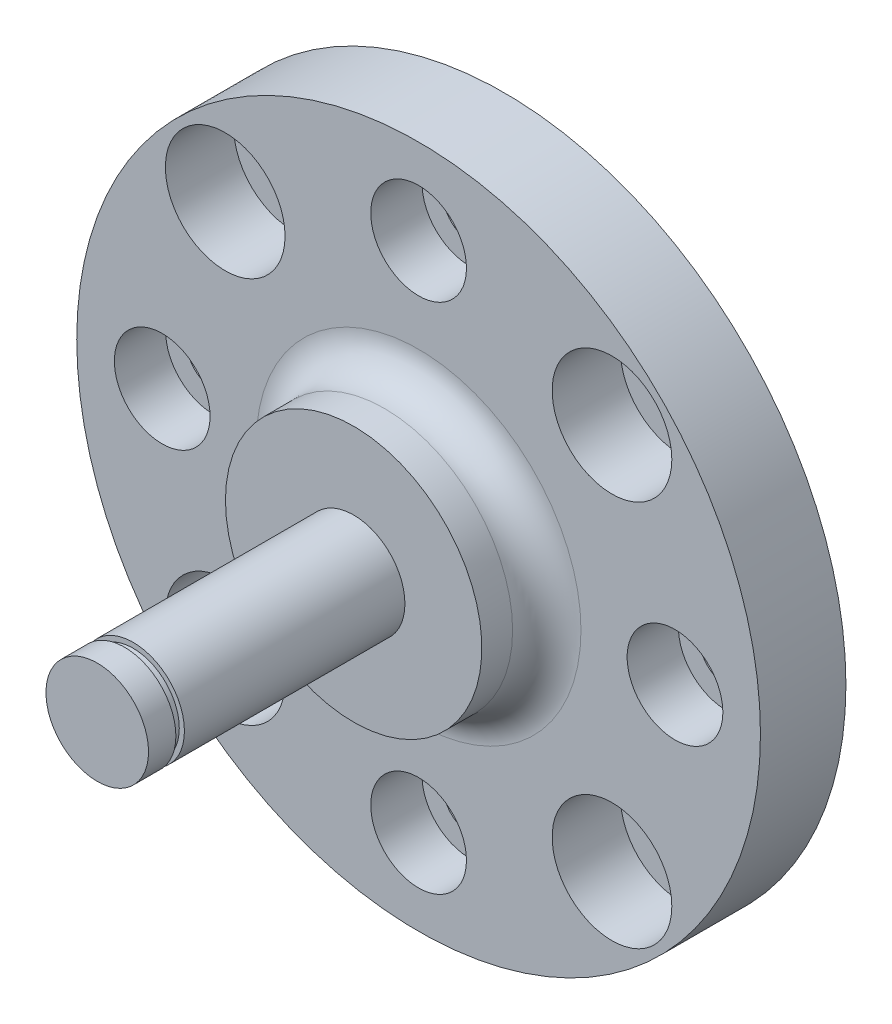
ISO-10303-21;
HEADER;
FILE_DESCRIPTION(('STEP AP214'),'2;1');
FILE_NAME('part.step','',(''),(''),'','','');
FILE_SCHEMA(('AUTOMOTIVE_DESIGN { 1 0 10303 214 1 1 1 1 }'));
ENDSEC;
DATA;
#1=APPLICATION_CONTEXT('core data for automotive mechanical design processes');
#2=APPLICATION_PROTOCOL_DEFINITION('international standard','automotive_design',2000,#1);
#3=PRODUCT_CONTEXT('',#1,'mechanical');
#4=PRODUCT('Part','Part','',(#3));
#5=PRODUCT_RELATED_PRODUCT_CATEGORY('part','',(#4));
#6=PRODUCT_DEFINITION_FORMATION('','',#4);
#7=PRODUCT_DEFINITION_CONTEXT('part definition',#1,'design');
#8=PRODUCT_DEFINITION('design','',#6,#7);
#9=PRODUCT_DEFINITION_SHAPE('','',#8);
#10=(LENGTH_UNIT() NAMED_UNIT(*) SI_UNIT(.MILLI.,.METRE.));
#11=(NAMED_UNIT(*) PLANE_ANGLE_UNIT() SI_UNIT($,.RADIAN.));
#12=(NAMED_UNIT(*) SI_UNIT($,.STERADIAN.) SOLID_ANGLE_UNIT());
#13=UNCERTAINTY_MEASURE_WITH_UNIT(LENGTH_MEASURE(1.E-05),#10,'distance_accuracy_value','');
#14=(GEOMETRIC_REPRESENTATION_CONTEXT(3) GLOBAL_UNCERTAINTY_ASSIGNED_CONTEXT((#13)) GLOBAL_UNIT_ASSIGNED_CONTEXT((#10,
#11,#12)) REPRESENTATION_CONTEXT('',''));
#15=CARTESIAN_POINT('',(0.,0.,0.));
#16=DIRECTION('',(0.,0.,1.));
#17=DIRECTION('',(1.,0.,0.));
#18=AXIS2_PLACEMENT_3D('',#15,#16,#17);
#19=CARTESIAN_POINT('',(0.,0.,23.8));
#20=DIRECTION('',(0.,0.,-1.));
#21=DIRECTION('',(-1.,0.,0.));
#22=AXIS2_PLACEMENT_3D('',#19,#20,#21);
#23=CYLINDRICAL_SURFACE('',#22,3.);
#24=CARTESIAN_POINT('',(0.,0.,8.8));
#25=DIRECTION('',(0.,0.,1.));
#26=DIRECTION('',(1.,0.,0.));
#27=AXIS2_PLACEMENT_3D('',#24,#25,#26);
#28=CIRCLE('',#27,3.);
#29=CARTESIAN_POINT('',(3.,0.,8.8));
#30=VERTEX_POINT('',#29);
#31=EDGE_CURVE('E42',#30,#30,#28,.T.);
#32=ORIENTED_EDGE('',*,*,#31,.T.);
#33=EDGE_LOOP('',(#32));
#34=FACE_BOUND('',#33,.T.);
#35=CARTESIAN_POINT('',(0.,0.,21.7));
#36=DIRECTION('',(0.,0.,1.));
#37=DIRECTION('',(1.,0.,0.));
#38=AXIS2_PLACEMENT_3D('',#35,#36,#37);
#39=CIRCLE('',#38,3.);
#40=CARTESIAN_POINT('',(3.,0.,21.7));
#41=VERTEX_POINT('',#40);
#42=EDGE_CURVE('E157',#41,#41,#39,.T.);
#43=ORIENTED_EDGE('',*,*,#42,.F.);
#44=EDGE_LOOP('',(#43));
#45=FACE_BOUND('',#44,.T.);
#46=ADVANCED_FACE('F31',(#34,#45),#23,.T.);
#47=CARTESIAN_POINT('',(-11.3137084989848,11.3137084989847,5.));
#48=DIRECTION('',(0.,0.,-1.));
#49=DIRECTION('',(-1.,0.,0.));
#50=AXIS2_PLACEMENT_3D('',#47,#48,#49);
#51=CYLINDRICAL_SURFACE('',#50,2.05);
#52=CARTESIAN_POINT('',(-11.3137084989848,11.3137084989847,0.));
#53=DIRECTION('',(0.,0.,1.));
#54=DIRECTION('',(1.,0.,0.));
#55=AXIS2_PLACEMENT_3D('',#52,#53,#54);
#56=CIRCLE('',#55,2.05);
#57=CARTESIAN_POINT('',(-9.26370849898478,11.3137084989847,0.));
#58=VERTEX_POINT('',#57);
#59=EDGE_CURVE('E85',#58,#58,#56,.T.);
#60=ORIENTED_EDGE('',*,*,#59,.F.);
#61=EDGE_LOOP('',(#60));
#62=FACE_BOUND('',#61,.T.);
#63=CARTESIAN_POINT('',(-11.3137084989848,11.3137084989847,1.));
#64=DIRECTION('',(0.,0.,1.));
#65=DIRECTION('',(1.,0.,0.));
#66=AXIS2_PLACEMENT_3D('',#63,#64,#65);
#67=CIRCLE('',#66,2.05);
#68=CARTESIAN_POINT('',(-9.26370849898478,11.3137084989847,1.));
#69=VERTEX_POINT('',#68);
#70=EDGE_CURVE('E49',#69,#69,#67,.T.);
#71=ORIENTED_EDGE('',*,*,#70,.T.);
#72=EDGE_LOOP('',(#71));
#73=FACE_BOUND('',#72,.T.);
#74=ADVANCED_FACE('F189',(#62,#73),#51,.F.);
#75=CARTESIAN_POINT('',(11.3137084989852,11.3137084989855,5.));
#76=DIRECTION('',(0.,0.,-1.));
#77=DIRECTION('',(-1.,0.,0.));
#78=AXIS2_PLACEMENT_3D('',#75,#76,#77);
#79=CYLINDRICAL_SURFACE('',#78,2.05000000000063);
#80=CARTESIAN_POINT('',(11.3137084989852,11.3137084989855,0.));
#81=DIRECTION('',(0.,0.,1.));
#82=DIRECTION('',(1.,0.,0.));
#83=AXIS2_PLACEMENT_3D('',#80,#81,#82);
#84=CIRCLE('',#83,2.05000000000063);
#85=CARTESIAN_POINT('',(13.3637084989858,11.3137084989855,0.));
#86=VERTEX_POINT('',#85);
#87=EDGE_CURVE('E91',#86,#86,#84,.T.);
#88=ORIENTED_EDGE('',*,*,#87,.F.);
#89=EDGE_LOOP('',(#88));
#90=FACE_BOUND('',#89,.T.);
#91=CARTESIAN_POINT('',(11.3137084989852,11.3137084989855,1.));
#92=DIRECTION('',(0.,0.,1.));
#93=DIRECTION('',(1.,0.,0.));
#94=AXIS2_PLACEMENT_3D('',#91,#92,#93);
#95=CIRCLE('',#94,2.05000000000063);
#96=CARTESIAN_POINT('',(13.3637084989858,11.3137084989855,1.));
#97=VERTEX_POINT('',#96);
#98=EDGE_CURVE('E53',#97,#97,#95,.T.);
#99=ORIENTED_EDGE('',*,*,#98,.T.);
#100=EDGE_LOOP('',(#99));
#101=FACE_BOUND('',#100,.T.);
#102=ADVANCED_FACE('F198',(#90,#101),#79,.F.);
#103=CARTESIAN_POINT('',(11.3137084989859,-11.3137084989844,5.));
#104=DIRECTION('',(0.,0.,-1.));
#105=DIRECTION('',(-1.,0.,0.));
#106=AXIS2_PLACEMENT_3D('',#103,#104,#105);
#107=CYLINDRICAL_SURFACE('',#106,2.05000000000131);
#108=CARTESIAN_POINT('',(11.3137084989859,-11.3137084989844,0.));
#109=DIRECTION('',(0.,0.,1.));
#110=DIRECTION('',(1.,0.,0.));
#111=AXIS2_PLACEMENT_3D('',#108,#109,#110);
#112=CIRCLE('',#111,2.05000000000131);
#113=CARTESIAN_POINT('',(13.3637084989873,-11.3137084989844,0.));
#114=VERTEX_POINT('',#113);
#115=EDGE_CURVE('E97',#114,#114,#112,.T.);
#116=ORIENTED_EDGE('',*,*,#115,.F.);
#117=EDGE_LOOP('',(#116));
#118=FACE_BOUND('',#117,.T.);
#119=CARTESIAN_POINT('',(11.3137084989859,-11.3137084989844,1.));
#120=DIRECTION('',(0.,0.,1.));
#121=DIRECTION('',(1.,0.,0.));
#122=AXIS2_PLACEMENT_3D('',#119,#120,#121);
#123=CIRCLE('',#122,2.05000000000131);
#124=CARTESIAN_POINT('',(13.3637084989873,-11.3137084989844,1.));
#125=VERTEX_POINT('',#124);
#126=EDGE_CURVE('E56',#125,#125,#123,.T.);
#127=ORIENTED_EDGE('',*,*,#126,.T.);
#128=EDGE_LOOP('',(#127));
#129=FACE_BOUND('',#128,.T.);
#130=ADVANCED_FACE('F352',(#118,#129),#107,.F.);
#131=CARTESIAN_POINT('',(-11.313708498984,-11.3137084989852,5.));
#132=DIRECTION('',(0.,0.,-1.));
#133=DIRECTION('',(-1.,0.,0.));
#134=AXIS2_PLACEMENT_3D('',#131,#132,#133);
#135=CYLINDRICAL_SURFACE('',#134,2.05000000000077);
#136=CARTESIAN_POINT('',(-11.313708498984,-11.3137084989852,0.));
#137=DIRECTION('',(0.,0.,1.));
#138=DIRECTION('',(1.,0.,0.));
#139=AXIS2_PLACEMENT_3D('',#136,#137,#138);
#140=CIRCLE('',#139,2.05000000000077);
#141=CARTESIAN_POINT('',(-9.26370849898322,-11.3137084989852,0.));
#142=VERTEX_POINT('',#141);
#143=EDGE_CURVE('E66',#142,#142,#140,.T.);
#144=ORIENTED_EDGE('',*,*,#143,.F.);
#145=EDGE_LOOP('',(#144));
#146=FACE_BOUND('',#145,.T.);
#147=CARTESIAN_POINT('',(-11.313708498984,-11.3137084989852,1.));
#148=DIRECTION('',(0.,0.,1.));
#149=DIRECTION('',(1.,0.,0.));
#150=AXIS2_PLACEMENT_3D('',#147,#148,#149);
#151=CIRCLE('',#150,2.05000000000077);
#152=CARTESIAN_POINT('',(-9.26370849898322,-11.3137084989852,1.));
#153=VERTEX_POINT('',#152);
#154=EDGE_CURVE('E59',#153,#153,#151,.T.);
#155=ORIENTED_EDGE('',*,*,#154,.T.);
#156=EDGE_LOOP('',(#155));
#157=FACE_BOUND('',#156,.T.);
#158=ADVANCED_FACE('F362',(#146,#157),#135,.F.);
#159=CARTESIAN_POINT('',(0.,15.,5.));
#160=DIRECTION('',(0.,0.,-1.));
#161=DIRECTION('',(-1.,0.,0.));
#162=AXIS2_PLACEMENT_3D('',#159,#160,#161);
#163=CYLINDRICAL_SURFACE('',#162,1.55);
#164=CARTESIAN_POINT('',(0.,15.,0.));
#165=DIRECTION('',(0.,0.,1.));
#166=DIRECTION('',(1.,0.,0.));
#167=AXIS2_PLACEMENT_3D('',#164,#165,#166);
#168=CIRCLE('',#167,1.55);
#169=CARTESIAN_POINT('',(1.55,15.,0.));
#170=VERTEX_POINT('',#169);
#171=EDGE_CURVE('E80',#170,#170,#168,.T.);
#172=ORIENTED_EDGE('',*,*,#171,.F.);
#173=EDGE_LOOP('',(#172));
#174=FACE_BOUND('',#173,.T.);
#175=CARTESIAN_POINT('',(0.,15.,2.));
#176=DIRECTION('',(0.,0.,1.));
#177=DIRECTION('',(1.,0.,0.));
#178=AXIS2_PLACEMENT_3D('',#175,#176,#177);
#179=CIRCLE('',#178,1.55);
#180=CARTESIAN_POINT('',(1.55,15.,2.));
#181=VERTEX_POINT('',#180);
#182=EDGE_CURVE('E63',#181,#181,#179,.T.);
#183=ORIENTED_EDGE('',*,*,#182,.T.);
#184=EDGE_LOOP('',(#183));
#185=FACE_BOUND('',#184,.T.);
#186=ADVANCED_FACE('F371',(#174,#185),#163,.F.);
#187=CARTESIAN_POINT('',(15.0000000000004,7.41302138017884E-13,5.));
#188=DIRECTION('',(0.,0.,-1.));
#189=DIRECTION('',(-1.,0.,0.));
#190=AXIS2_PLACEMENT_3D('',#187,#188,#189);
#191=CYLINDRICAL_SURFACE('',#190,1.55000000000063);
#192=CARTESIAN_POINT('',(15.0000000000004,7.41302138017884E-13,0.));
#193=DIRECTION('',(0.,0.,1.));
#194=DIRECTION('',(1.,0.,0.));
#195=AXIS2_PLACEMENT_3D('',#192,#193,#194);
#196=CIRCLE('',#195,1.55000000000063);
#197=CARTESIAN_POINT('',(16.5500000000011,7.41302138017884E-13,0.));
#198=VERTEX_POINT('',#197);
#199=EDGE_CURVE('E88',#198,#198,#196,.T.);
#200=ORIENTED_EDGE('',*,*,#199,.F.);
#201=EDGE_LOOP('',(#200));
#202=FACE_BOUND('',#201,.T.);
#203=CARTESIAN_POINT('',(15.0000000000004,7.41302138017884E-13,2.));
#204=DIRECTION('',(0.,0.,1.));
#205=DIRECTION('',(1.,0.,0.));
#206=AXIS2_PLACEMENT_3D('',#203,#204,#205);
#207=CIRCLE('',#206,1.55000000000063);
#208=CARTESIAN_POINT('',(16.5500000000011,7.41302138017884E-13,2.));
#209=VERTEX_POINT('',#208);
#210=EDGE_CURVE('E67',#209,#209,#207,.T.);
#211=ORIENTED_EDGE('',*,*,#210,.T.);
#212=EDGE_LOOP('',(#211));
#213=FACE_BOUND('',#212,.T.);
#214=ADVANCED_FACE('F453',(#202,#213),#191,.F.);
#215=CARTESIAN_POINT('',(1.16688460340799E-12,-14.9999999999997,5.));
#216=DIRECTION('',(0.,0.,-1.));
#217=DIRECTION('',(-1.,0.,0.));
#218=AXIS2_PLACEMENT_3D('',#215,#216,#217);
#219=CYLINDRICAL_SURFACE('',#218,1.55000000000131);
#220=CARTESIAN_POINT('',(1.16688460340799E-12,-14.9999999999997,0.));
#221=DIRECTION('',(0.,0.,1.));
#222=DIRECTION('',(1.,0.,0.));
#223=AXIS2_PLACEMENT_3D('',#220,#221,#222);
#224=CIRCLE('',#223,1.55000000000131);
#225=CARTESIAN_POINT('',(1.55000000000247,-14.9999999999997,0.));
#226=VERTEX_POINT('',#225);
#227=EDGE_CURVE('E94',#226,#226,#224,.T.);
#228=ORIENTED_EDGE('',*,*,#227,.F.);
#229=EDGE_LOOP('',(#228));
#230=FACE_BOUND('',#229,.T.);
#231=CARTESIAN_POINT('',(1.16688460340799E-12,-14.9999999999997,2.));
#232=DIRECTION('',(0.,0.,1.));
#233=DIRECTION('',(1.,0.,0.));
#234=AXIS2_PLACEMENT_3D('',#231,#232,#233);
#235=CIRCLE('',#234,1.55000000000131);
#236=CARTESIAN_POINT('',(1.55000000000247,-14.9999999999997,2.));
#237=VERTEX_POINT('',#236);
#238=EDGE_CURVE('E70',#237,#237,#235,.T.);
#239=ORIENTED_EDGE('',*,*,#238,.T.);
#240=EDGE_LOOP('',(#239));
#241=FACE_BOUND('',#240,.T.);
#242=ADVANCED_FACE('F463',(#230,#241),#219,.F.);
#243=CARTESIAN_POINT('',(-14.9999999999993,-4.27419435588827E-13,5.));
#244=DIRECTION('',(0.,0.,-1.));
#245=DIRECTION('',(-1.,0.,0.));
#246=AXIS2_PLACEMENT_3D('',#243,#244,#245);
#247=CYLINDRICAL_SURFACE('',#246,1.55000000000078);
#248=CARTESIAN_POINT('',(-14.9999999999993,-4.27419435588827E-13,0.));
#249=DIRECTION('',(0.,0.,1.));
#250=DIRECTION('',(1.,0.,0.));
#251=AXIS2_PLACEMENT_3D('',#248,#249,#250);
#252=CIRCLE('',#251,1.55000000000078);
#253=CARTESIAN_POINT('',(-13.4499999999985,-4.27419435588827E-13,0.));
#254=VERTEX_POINT('',#253);
#255=EDGE_CURVE('E100',#254,#254,#252,.T.);
#256=ORIENTED_EDGE('',*,*,#255,.F.);
#257=EDGE_LOOP('',(#256));
#258=FACE_BOUND('',#257,.T.);
#259=CARTESIAN_POINT('',(-14.9999999999993,-4.27419435588827E-13,2.));
#260=DIRECTION('',(0.,0.,1.));
#261=DIRECTION('',(1.,0.,0.));
#262=AXIS2_PLACEMENT_3D('',#259,#260,#261);
#263=CIRCLE('',#262,1.55000000000078);
#264=CARTESIAN_POINT('',(-13.4499999999985,-4.27419435588827E-13,2.));
#265=VERTEX_POINT('',#264);
#266=EDGE_CURVE('E73',#265,#265,#263,.T.);
#267=ORIENTED_EDGE('',*,*,#266,.T.);
#268=EDGE_LOOP('',(#267));
#269=FACE_BOUND('',#268,.T.);
#270=ADVANCED_FACE('F472',(#258,#269),#247,.F.);
#271=CARTESIAN_POINT('',(0.,0.,5.));
#272=DIRECTION('',(0.,0.,1.));
#273=DIRECTION('',(1.,0.,0.));
#274=AXIS2_PLACEMENT_3D('',#271,#272,#273);
#275=PLANE('',#274);
#276=CARTESIAN_POINT('',(0.,0.,5.));
#277=DIRECTION('',(0.,0.,1.));
#278=DIRECTION('',(1.,0.,0.));
#279=AXIS2_PLACEMENT_3D('',#276,#277,#278);
#280=CIRCLE('',#279,9.5);
#281=CARTESIAN_POINT('',(9.5,0.,5.));
#282=VERTEX_POINT('',#281);
#283=EDGE_CURVE('E10',#282,#282,#280,.F.);
#284=ORIENTED_EDGE('',*,*,#283,.T.);
#285=EDGE_LOOP('',(#284));
#286=FACE_BOUND('',#285,.T.);
#287=CARTESIAN_POINT('',(-11.3137084989844,-11.3137084989848,5.));
#288=DIRECTION('',(0.,0.,1.));
#289=DIRECTION('',(1.,0.,0.));
#290=AXIS2_PLACEMENT_3D('',#287,#288,#289);
#291=CIRCLE('',#290,3.50000000000024);
#292=CARTESIAN_POINT('',(-7.81370849898418,-11.3137084989848,5.));
#293=VERTEX_POINT('',#292);
#294=EDGE_CURVE('E133',#293,#293,#291,.T.);
#295=ORIENTED_EDGE('',*,*,#294,.F.);
#296=EDGE_LOOP('',(#295));
#297=FACE_BOUND('',#296,.T.);
#298=CARTESIAN_POINT('',(11.3137084989851,-11.3137084989844,5.));
#299=DIRECTION('',(0.,0.,1.));
#300=DIRECTION('',(1.,0.,0.));
#301=AXIS2_PLACEMENT_3D('',#298,#299,#300);
#302=CIRCLE('',#301,3.50000000000049);
#303=CARTESIAN_POINT('',(14.8137084989856,-11.3137084989844,5.));
#304=VERTEX_POINT('',#303);
#305=EDGE_CURVE('E140',#304,#304,#302,.T.);
#306=ORIENTED_EDGE('',*,*,#305,.F.);
#307=EDGE_LOOP('',(#306));
#308=FACE_BOUND('',#307,.T.);
#309=CARTESIAN_POINT('',(11.3137084989847,11.3137084989851,5.));
#310=DIRECTION('',(0.,0.,1.));
#311=DIRECTION('',(1.,0.,0.));
#312=AXIS2_PLACEMENT_3D('',#309,#310,#311);
#313=CIRCLE('',#312,3.50000000000035);
#314=CARTESIAN_POINT('',(14.8137084989851,11.3137084989851,5.));
#315=VERTEX_POINT('',#314);
#316=EDGE_CURVE('E146',#315,#315,#313,.T.);
#317=ORIENTED_EDGE('',*,*,#316,.F.);
#318=EDGE_LOOP('',(#317));
#319=FACE_BOUND('',#318,.T.);
#320=CARTESIAN_POINT('',(-11.3137084989848,11.3137084989847,5.));
#321=DIRECTION('',(0.,0.,1.));
#322=DIRECTION('',(1.,0.,0.));
#323=AXIS2_PLACEMENT_3D('',#320,#321,#322);
#324=CIRCLE('',#323,3.5);
#325=CARTESIAN_POINT('',(-7.81370849898478,11.3137084989847,5.));
#326=VERTEX_POINT('',#325);
#327=EDGE_CURVE('E127',#326,#326,#324,.T.);
#328=ORIENTED_EDGE('',*,*,#327,.F.);
#329=EDGE_LOOP('',(#328));
#330=FACE_BOUND('',#329,.T.);
#331=CARTESIAN_POINT('',(0.,15.,5.));
#332=DIRECTION('',(0.,0.,1.));
#333=DIRECTION('',(1.,0.,0.));
#334=AXIS2_PLACEMENT_3D('',#331,#332,#333);
#335=CIRCLE('',#334,2.8);
#336=CARTESIAN_POINT('',(2.8,15.,5.));
#337=VERTEX_POINT('',#336);
#338=EDGE_CURVE('E122',#337,#337,#335,.T.);
#339=ORIENTED_EDGE('',*,*,#338,.F.);
#340=EDGE_LOOP('',(#339));
#341=FACE_BOUND('',#340,.T.);
#342=CARTESIAN_POINT('',(15.,0.,5.));
#343=DIRECTION('',(0.,0.,1.));
#344=DIRECTION('',(1.,0.,0.));
#345=AXIS2_PLACEMENT_3D('',#342,#343,#344);
#346=CIRCLE('',#345,2.8);
#347=CARTESIAN_POINT('',(17.8,0.,5.));
#348=VERTEX_POINT('',#347);
#349=EDGE_CURVE('E116',#348,#348,#346,.T.);
#350=ORIENTED_EDGE('',*,*,#349,.F.);
#351=EDGE_LOOP('',(#350));
#352=FACE_BOUND('',#351,.T.);
#353=CARTESIAN_POINT('',(4.20814730859897E-13,-15.,5.));
#354=DIRECTION('',(0.,0.,1.));
#355=DIRECTION('',(1.,0.,0.));
#356=AXIS2_PLACEMENT_3D('',#353,#354,#355);
#357=CIRCLE('',#356,2.8000000000005);
#358=CARTESIAN_POINT('',(2.80000000000092,-15.,5.));
#359=VERTEX_POINT('',#358);
#360=EDGE_CURVE('E110',#359,#359,#357,.T.);
#361=ORIENTED_EDGE('',*,*,#360,.F.);
#362=EDGE_LOOP('',(#361));
#363=FACE_BOUND('',#362,.T.);
#364=CARTESIAN_POINT('',(-14.9999999999998,-2.1224433562867E-13,5.));
#365=DIRECTION('',(0.,0.,1.));
#366=DIRECTION('',(1.,0.,0.));
#367=AXIS2_PLACEMENT_3D('',#364,#365,#366);
#368=CIRCLE('',#367,2.80000000000042);
#369=CARTESIAN_POINT('',(-12.1999999999994,-2.1224433562867E-13,5.));
#370=VERTEX_POINT('',#369);
#371=EDGE_CURVE('E52',#370,#370,#368,.T.);
#372=ORIENTED_EDGE('',*,*,#371,.F.);
#373=EDGE_LOOP('',(#372));
#374=FACE_BOUND('',#373,.T.);
#375=CARTESIAN_POINT('',(0.,0.,5.));
#376=DIRECTION('',(0.,0.,1.));
#377=DIRECTION('',(1.,0.,0.));
#378=AXIS2_PLACEMENT_3D('',#375,#376,#377);
#379=CIRCLE('',#378,20.);
#380=CARTESIAN_POINT('',(20.,0.,5.));
#381=VERTEX_POINT('',#380);
#382=EDGE_CURVE('E46',#381,#381,#379,.T.);
#383=ORIENTED_EDGE('',*,*,#382,.T.);
#384=EDGE_LOOP('',(#383));
#385=FACE_BOUND('',#384,.T.);
#386=ADVANCED_FACE('F480',(#286,#297,#308,#319,#330,#341,#352,#363,#374,#385),#275,.T.);
#387=CARTESIAN_POINT('',(0.,0.,0.));
#388=DIRECTION('',(0.,0.,1.));
#389=DIRECTION('',(1.,0.,0.));
#390=AXIS2_PLACEMENT_3D('',#387,#388,#389);
#391=PLANE('',#390);
#392=CARTESIAN_POINT('',(0.,0.,0.));
#393=DIRECTION('',(0.,0.,1.));
#394=DIRECTION('',(1.,0.,0.));
#395=AXIS2_PLACEMENT_3D('',#392,#393,#394);
#396=CIRCLE('',#395,20.);
#397=CARTESIAN_POINT('',(20.,0.,0.));
#398=VERTEX_POINT('',#397);
#399=EDGE_CURVE('E77',#398,#398,#396,.T.);
#400=ORIENTED_EDGE('',*,*,#399,.F.);
#401=EDGE_LOOP('',(#400));
#402=FACE_BOUND('',#401,.T.);
#403=ORIENTED_EDGE('',*,*,#171,.T.);
#404=EDGE_LOOP('',(#403));
#405=FACE_BOUND('',#404,.T.);
#406=ORIENTED_EDGE('',*,*,#59,.T.);
#407=EDGE_LOOP('',(#406));
#408=FACE_BOUND('',#407,.T.);
#409=ORIENTED_EDGE('',*,*,#199,.T.);
#410=EDGE_LOOP('',(#409));
#411=FACE_BOUND('',#410,.T.);
#412=ORIENTED_EDGE('',*,*,#87,.T.);
#413=EDGE_LOOP('',(#412));
#414=FACE_BOUND('',#413,.T.);
#415=ORIENTED_EDGE('',*,*,#227,.T.);
#416=EDGE_LOOP('',(#415));
#417=FACE_BOUND('',#416,.T.);
#418=ORIENTED_EDGE('',*,*,#115,.T.);
#419=EDGE_LOOP('',(#418));
#420=FACE_BOUND('',#419,.T.);
#421=ORIENTED_EDGE('',*,*,#255,.T.);
#422=EDGE_LOOP('',(#421));
#423=FACE_BOUND('',#422,.T.);
#424=ORIENTED_EDGE('',*,*,#143,.T.);
#425=EDGE_LOOP('',(#424));
#426=FACE_BOUND('',#425,.T.);
#427=ADVANCED_FACE('F488',(#402,#405,#408,#411,#414,#417,#420,#423,#426),#391,.F.);
#428=CARTESIAN_POINT('',(0.,0.,5.));
#429=DIRECTION('',(0.,0.,-1.));
#430=DIRECTION('',(-1.,0.,0.));
#431=AXIS2_PLACEMENT_3D('',#428,#429,#430);
#432=CYLINDRICAL_SURFACE('',#431,20.);
#433=ORIENTED_EDGE('',*,*,#382,.F.);
#434=EDGE_LOOP('',(#433));
#435=FACE_BOUND('',#434,.T.);
#436=ORIENTED_EDGE('',*,*,#399,.T.);
#437=EDGE_LOOP('',(#436));
#438=FACE_BOUND('',#437,.T.);
#439=ADVANCED_FACE('F443',(#435,#438),#432,.T.);
#440=CARTESIAN_POINT('',(-14.9999999999998,-2.1224433562867E-13,2.));
#441=DIRECTION('',(0.,0.,1.));
#442=DIRECTION('',(1.,0.,0.));
#443=AXIS2_PLACEMENT_3D('',#440,#441,#442);
#444=CYLINDRICAL_SURFACE('',#443,2.80000000000042);
#445=CARTESIAN_POINT('',(-14.9999999999998,-2.1224433562867E-13,2.));
#446=DIRECTION('',(0.,0.,1.));
#447=DIRECTION('',(1.,0.,0.));
#448=AXIS2_PLACEMENT_3D('',#445,#446,#447);
#449=CIRCLE('',#448,2.80000000000042);
#450=CARTESIAN_POINT('',(-12.1999999999994,-2.1224433562867E-13,2.));
#451=VERTEX_POINT('',#450);
#452=EDGE_CURVE('E107',#451,#451,#449,.T.);
#453=ORIENTED_EDGE('',*,*,#452,.F.);
#454=EDGE_LOOP('',(#453));
#455=FACE_BOUND('',#454,.T.);
#456=ORIENTED_EDGE('',*,*,#371,.T.);
#457=EDGE_LOOP('',(#456));
#458=FACE_BOUND('',#457,.T.);
#459=ADVANCED_FACE('F434',(#455,#458),#444,.F.);
#460=CARTESIAN_POINT('',(-14.9999999999998,-2.1224433562867E-13,2.));
#461=DIRECTION('',(0.,0.,1.));
#462=DIRECTION('',(1.,0.,0.));
#463=AXIS2_PLACEMENT_3D('',#460,#461,#462);
#464=PLANE('',#463);
#465=ORIENTED_EDGE('',*,*,#266,.F.);
#466=EDGE_LOOP('',(#465));
#467=FACE_BOUND('',#466,.T.);
#468=ORIENTED_EDGE('',*,*,#452,.T.);
#469=EDGE_LOOP('',(#468));
#470=FACE_BOUND('',#469,.T.);
#471=ADVANCED_FACE('F425',(#467,#470),#464,.T.);
#472=CARTESIAN_POINT('',(4.20814730859897E-13,-15.,2.));
#473=DIRECTION('',(0.,0.,1.));
#474=DIRECTION('',(1.,0.,0.));
#475=AXIS2_PLACEMENT_3D('',#472,#473,#474);
#476=CYLINDRICAL_SURFACE('',#475,2.8000000000005);
#477=CARTESIAN_POINT('',(4.20814730859897E-13,-15.,2.));
#478=DIRECTION('',(0.,0.,1.));
#479=DIRECTION('',(1.,0.,0.));
#480=AXIS2_PLACEMENT_3D('',#477,#478,#479);
#481=CIRCLE('',#480,2.8000000000005);
#482=CARTESIAN_POINT('',(2.80000000000092,-15.,2.));
#483=VERTEX_POINT('',#482);
#484=EDGE_CURVE('E113',#483,#483,#481,.T.);
#485=ORIENTED_EDGE('',*,*,#484,.F.);
#486=EDGE_LOOP('',(#485));
#487=FACE_BOUND('',#486,.T.);
#488=ORIENTED_EDGE('',*,*,#360,.T.);
#489=EDGE_LOOP('',(#488));
#490=FACE_BOUND('',#489,.T.);
#491=ADVANCED_FACE('F416',(#487,#490),#476,.F.);
#492=CARTESIAN_POINT('',(4.20814730859897E-13,-15.,2.));
#493=DIRECTION('',(0.,0.,1.));
#494=DIRECTION('',(1.,0.,0.));
#495=AXIS2_PLACEMENT_3D('',#492,#493,#494);
#496=PLANE('',#495);
#497=ORIENTED_EDGE('',*,*,#238,.F.);
#498=EDGE_LOOP('',(#497));
#499=FACE_BOUND('',#498,.T.);
#500=ORIENTED_EDGE('',*,*,#484,.T.);
#501=EDGE_LOOP('',(#500));
#502=FACE_BOUND('',#501,.T.);
#503=ADVANCED_FACE('F407',(#499,#502),#496,.T.);
#504=CARTESIAN_POINT('',(15.,0.,2.));
#505=DIRECTION('',(0.,0.,1.));
#506=DIRECTION('',(1.,0.,0.));
#507=AXIS2_PLACEMENT_3D('',#504,#505,#506);
#508=CYLINDRICAL_SURFACE('',#507,2.8);
#509=CARTESIAN_POINT('',(15.,0.,2.));
#510=DIRECTION('',(0.,0.,1.));
#511=DIRECTION('',(1.,0.,0.));
#512=AXIS2_PLACEMENT_3D('',#509,#510,#511);
#513=CIRCLE('',#512,2.8);
#514=CARTESIAN_POINT('',(17.8,0.,2.));
#515=VERTEX_POINT('',#514);
#516=EDGE_CURVE('E119',#515,#515,#513,.T.);
#517=ORIENTED_EDGE('',*,*,#516,.F.);
#518=EDGE_LOOP('',(#517));
#519=FACE_BOUND('',#518,.T.);
#520=ORIENTED_EDGE('',*,*,#349,.T.);
#521=EDGE_LOOP('',(#520));
#522=FACE_BOUND('',#521,.T.);
#523=ADVANCED_FACE('F398',(#519,#522),#508,.F.);
#524=CARTESIAN_POINT('',(15.,0.,2.));
#525=DIRECTION('',(0.,0.,1.));
#526=DIRECTION('',(1.,0.,0.));
#527=AXIS2_PLACEMENT_3D('',#524,#525,#526);
#528=PLANE('',#527);
#529=ORIENTED_EDGE('',*,*,#210,.F.);
#530=EDGE_LOOP('',(#529));
#531=FACE_BOUND('',#530,.T.);
#532=ORIENTED_EDGE('',*,*,#516,.T.);
#533=EDGE_LOOP('',(#532));
#534=FACE_BOUND('',#533,.T.);
#535=ADVANCED_FACE('F389',(#531,#534),#528,.T.);
#536=CARTESIAN_POINT('',(0.,15.,2.));
#537=DIRECTION('',(0.,0.,1.));
#538=DIRECTION('',(1.,0.,0.));
#539=AXIS2_PLACEMENT_3D('',#536,#537,#538);
#540=CYLINDRICAL_SURFACE('',#539,2.8);
#541=CARTESIAN_POINT('',(0.,15.,2.));
#542=DIRECTION('',(0.,0.,1.));
#543=DIRECTION('',(1.,0.,0.));
#544=AXIS2_PLACEMENT_3D('',#541,#542,#543);
#545=CIRCLE('',#544,2.8);
#546=CARTESIAN_POINT('',(2.8,15.,2.));
#547=VERTEX_POINT('',#546);
#548=EDGE_CURVE('E76',#547,#547,#545,.T.);
#549=ORIENTED_EDGE('',*,*,#548,.F.);
#550=EDGE_LOOP('',(#549));
#551=FACE_BOUND('',#550,.T.);
#552=ORIENTED_EDGE('',*,*,#338,.T.);
#553=EDGE_LOOP('',(#552));
#554=FACE_BOUND('',#553,.T.);
#555=ADVANCED_FACE('F380',(#551,#554),#540,.F.);
#556=CARTESIAN_POINT('',(0.,15.,2.));
#557=DIRECTION('',(0.,0.,1.));
#558=DIRECTION('',(1.,0.,0.));
#559=AXIS2_PLACEMENT_3D('',#556,#557,#558);
#560=PLANE('',#559);
#561=ORIENTED_EDGE('',*,*,#182,.F.);
#562=EDGE_LOOP('',(#561));
#563=FACE_BOUND('',#562,.T.);
#564=ORIENTED_EDGE('',*,*,#548,.T.);
#565=EDGE_LOOP('',(#564));
#566=FACE_BOUND('',#565,.T.);
#567=ADVANCED_FACE('F335',(#563,#566),#560,.T.);
#568=CARTESIAN_POINT('',(-11.3137084989844,-11.3137084989848,1.));
#569=DIRECTION('',(0.,0.,1.));
#570=DIRECTION('',(1.,0.,0.));
#571=AXIS2_PLACEMENT_3D('',#568,#569,#570);
#572=CYLINDRICAL_SURFACE('',#571,3.50000000000024);
#573=CARTESIAN_POINT('',(-11.3137084989844,-11.3137084989848,1.));
#574=DIRECTION('',(0.,0.,1.));
#575=DIRECTION('',(1.,0.,0.));
#576=AXIS2_PLACEMENT_3D('',#573,#574,#575);
#577=CIRCLE('',#576,3.50000000000024);
#578=CARTESIAN_POINT('',(-7.81370849898418,-11.3137084989848,1.));
#579=VERTEX_POINT('',#578);
#580=EDGE_CURVE('E136',#579,#579,#577,.T.);
#581=ORIENTED_EDGE('',*,*,#580,.F.);
#582=EDGE_LOOP('',(#581));
#583=FACE_BOUND('',#582,.T.);
#584=ORIENTED_EDGE('',*,*,#294,.T.);
#585=EDGE_LOOP('',(#584));
#586=FACE_BOUND('',#585,.T.);
#587=ADVANCED_FACE('F326',(#583,#586),#572,.F.);
#588=CARTESIAN_POINT('',(-11.3137084989844,-11.3137084989848,1.));
#589=DIRECTION('',(0.,0.,1.));
#590=DIRECTION('',(1.,0.,0.));
#591=AXIS2_PLACEMENT_3D('',#588,#589,#590);
#592=PLANE('',#591);
#593=ORIENTED_EDGE('',*,*,#154,.F.);
#594=EDGE_LOOP('',(#593));
#595=FACE_BOUND('',#594,.T.);
#596=ORIENTED_EDGE('',*,*,#580,.T.);
#597=EDGE_LOOP('',(#596));
#598=FACE_BOUND('',#597,.T.);
#599=ADVANCED_FACE('F317',(#595,#598),#592,.T.);
#600=CARTESIAN_POINT('',(11.3137084989851,-11.3137084989844,1.));
#601=DIRECTION('',(0.,0.,1.));
#602=DIRECTION('',(1.,0.,0.));
#603=AXIS2_PLACEMENT_3D('',#600,#601,#602);
#604=CYLINDRICAL_SURFACE('',#603,3.50000000000049);
#605=CARTESIAN_POINT('',(11.3137084989851,-11.3137084989844,1.));
#606=DIRECTION('',(0.,0.,1.));
#607=DIRECTION('',(1.,0.,0.));
#608=AXIS2_PLACEMENT_3D('',#605,#606,#607);
#609=CIRCLE('',#608,3.50000000000049);
#610=CARTESIAN_POINT('',(14.8137084989856,-11.3137084989844,1.));
#611=VERTEX_POINT('',#610);
#612=EDGE_CURVE('E143',#611,#611,#609,.T.);
#613=ORIENTED_EDGE('',*,*,#612,.F.);
#614=EDGE_LOOP('',(#613));
#615=FACE_BOUND('',#614,.T.);
#616=ORIENTED_EDGE('',*,*,#305,.T.);
#617=EDGE_LOOP('',(#616));
#618=FACE_BOUND('',#617,.T.);
#619=ADVANCED_FACE('F308',(#615,#618),#604,.F.);
#620=CARTESIAN_POINT('',(11.3137084989851,-11.3137084989844,1.));
#621=DIRECTION('',(0.,0.,1.));
#622=DIRECTION('',(1.,0.,0.));
#623=AXIS2_PLACEMENT_3D('',#620,#621,#622);
#624=PLANE('',#623);
#625=ORIENTED_EDGE('',*,*,#126,.F.);
#626=EDGE_LOOP('',(#625));
#627=FACE_BOUND('',#626,.T.);
#628=ORIENTED_EDGE('',*,*,#612,.T.);
#629=EDGE_LOOP('',(#628));
#630=FACE_BOUND('',#629,.T.);
#631=ADVANCED_FACE('F299',(#627,#630),#624,.T.);
#632=CARTESIAN_POINT('',(11.3137084989847,11.3137084989851,1.));
#633=DIRECTION('',(0.,0.,1.));
#634=DIRECTION('',(1.,0.,0.));
#635=AXIS2_PLACEMENT_3D('',#632,#633,#634);
#636=CYLINDRICAL_SURFACE('',#635,3.50000000000035);
#637=CARTESIAN_POINT('',(11.3137084989847,11.3137084989851,1.));
#638=DIRECTION('',(0.,0.,1.));
#639=DIRECTION('',(1.,0.,0.));
#640=AXIS2_PLACEMENT_3D('',#637,#638,#639);
#641=CIRCLE('',#640,3.50000000000035);
#642=CARTESIAN_POINT('',(14.8137084989851,11.3137084989851,1.));
#643=VERTEX_POINT('',#642);
#644=EDGE_CURVE('E130',#643,#643,#641,.T.);
#645=ORIENTED_EDGE('',*,*,#644,.F.);
#646=EDGE_LOOP('',(#645));
#647=FACE_BOUND('',#646,.T.);
#648=ORIENTED_EDGE('',*,*,#316,.T.);
#649=EDGE_LOOP('',(#648));
#650=FACE_BOUND('',#649,.T.);
#651=ADVANCED_FACE('F290',(#647,#650),#636,.F.);
#652=CARTESIAN_POINT('',(11.3137084989847,11.3137084989851,1.));
#653=DIRECTION('',(0.,0.,1.));
#654=DIRECTION('',(1.,0.,0.));
#655=AXIS2_PLACEMENT_3D('',#652,#653,#654);
#656=PLANE('',#655);
#657=ORIENTED_EDGE('',*,*,#98,.F.);
#658=EDGE_LOOP('',(#657));
#659=FACE_BOUND('',#658,.T.);
#660=ORIENTED_EDGE('',*,*,#644,.T.);
#661=EDGE_LOOP('',(#660));
#662=FACE_BOUND('',#661,.T.);
#663=ADVANCED_FACE('F281',(#659,#662),#656,.T.);
#664=CARTESIAN_POINT('',(-11.3137084989848,11.3137084989847,1.));
#665=DIRECTION('',(0.,0.,1.));
#666=DIRECTION('',(1.,0.,0.));
#667=AXIS2_PLACEMENT_3D('',#664,#665,#666);
#668=CYLINDRICAL_SURFACE('',#667,3.5);
#669=CARTESIAN_POINT('',(-11.3137084989848,11.3137084989847,1.));
#670=DIRECTION('',(0.,0.,1.));
#671=DIRECTION('',(1.,0.,0.));
#672=AXIS2_PLACEMENT_3D('',#669,#670,#671);
#673=CIRCLE('',#672,3.5);
#674=CARTESIAN_POINT('',(-7.81370849898478,11.3137084989847,1.));
#675=VERTEX_POINT('',#674);
#676=EDGE_CURVE('E62',#675,#675,#673,.T.);
#677=ORIENTED_EDGE('',*,*,#676,.F.);
#678=EDGE_LOOP('',(#677));
#679=FACE_BOUND('',#678,.T.);
#680=ORIENTED_EDGE('',*,*,#327,.T.);
#681=EDGE_LOOP('',(#680));
#682=FACE_BOUND('',#681,.T.);
#683=ADVANCED_FACE('F272',(#679,#682),#668,.F.);
#684=CARTESIAN_POINT('',(-11.3137084989848,11.3137084989847,1.));
#685=DIRECTION('',(0.,0.,1.));
#686=DIRECTION('',(1.,0.,0.));
#687=AXIS2_PLACEMENT_3D('',#684,#685,#686);
#688=PLANE('',#687);
#689=ORIENTED_EDGE('',*,*,#70,.F.);
#690=EDGE_LOOP('',(#689));
#691=FACE_BOUND('',#690,.T.);
#692=ORIENTED_EDGE('',*,*,#676,.T.);
#693=EDGE_LOOP('',(#692));
#694=FACE_BOUND('',#693,.T.);
#695=ADVANCED_FACE('F264',(#691,#694),#688,.T.);
#696=CARTESIAN_POINT('',(0.,0.,8.8));
#697=DIRECTION('',(0.,0.,-1.));
#698=DIRECTION('',(-1.,0.,0.));
#699=AXIS2_PLACEMENT_3D('',#696,#697,#698);
#700=CYLINDRICAL_SURFACE('',#699,7.5);
#701=CARTESIAN_POINT('',(0.,0.,7.));
#702=DIRECTION('',(0.,0.,1.));
#703=DIRECTION('',(1.,0.,0.));
#704=AXIS2_PLACEMENT_3D('',#701,#702,#703);
#705=CIRCLE('',#704,7.5);
#706=CARTESIAN_POINT('',(-7.5,0.,7.));
#707=VERTEX_POINT('',#706);
#708=EDGE_CURVE('E38',#707,#707,#705,.T.);
#709=CARTESIAN_POINT('',(0.,0.,8.8));
#710=DIRECTION('',(0.,0.,1.));
#711=DIRECTION('',(1.,0.,0.));
#712=AXIS2_PLACEMENT_3D('',#709,#710,#711);
#713=CIRCLE('',#712,7.5);
#714=CARTESIAN_POINT('',(-7.5,0.,8.8));
#715=VERTEX_POINT('',#714);
#716=EDGE_CURVE('E137',#715,#715,#713,.T.);
#717=CARTESIAN_POINT('',(-7.5,0.,7.));
#718=CARTESIAN_POINT('',(-7.5,0.,7.01875));
#719=CARTESIAN_POINT('',(-7.5,0.,7.0375));
#720=CARTESIAN_POINT('',(-7.5,0.,7.075));
#721=CARTESIAN_POINT('',(-7.5,0.,7.09375));
#722=CARTESIAN_POINT('',(-7.5,0.,7.13125));
#723=CARTESIAN_POINT('',(-7.5,0.,7.15));
#724=CARTESIAN_POINT('',(-7.5,0.,7.1875));
#725=CARTESIAN_POINT('',(-7.5,0.,7.20625));
#726=CARTESIAN_POINT('',(-7.5,0.,7.24375));
#727=CARTESIAN_POINT('',(-7.5,0.,7.2625));
#728=CARTESIAN_POINT('',(-7.5,0.,7.3));
#729=CARTESIAN_POINT('',(-7.5,0.,7.31875));
#730=CARTESIAN_POINT('',(-7.5,0.,7.35625));
#731=CARTESIAN_POINT('',(-7.5,0.,7.375));
#732=CARTESIAN_POINT('',(-7.5,0.,7.4125));
#733=CARTESIAN_POINT('',(-7.5,0.,7.43125));
#734=CARTESIAN_POINT('',(-7.5,0.,7.46875));
#735=CARTESIAN_POINT('',(-7.5,0.,7.4875));
#736=CARTESIAN_POINT('',(-7.5,0.,7.525));
#737=CARTESIAN_POINT('',(-7.5,0.,7.54375));
#738=CARTESIAN_POINT('',(-7.5,0.,7.58125));
#739=CARTESIAN_POINT('',(-7.5,0.,7.6));
#740=CARTESIAN_POINT('',(-7.5,0.,7.6375));
#741=CARTESIAN_POINT('',(-7.5,0.,7.65625));
#742=CARTESIAN_POINT('',(-7.5,0.,7.69375));
#743=CARTESIAN_POINT('',(-7.5,0.,7.7125));
#744=CARTESIAN_POINT('',(-7.5,0.,7.75));
#745=CARTESIAN_POINT('',(-7.5,0.,7.76875));
#746=CARTESIAN_POINT('',(-7.5,0.,7.80625));
#747=CARTESIAN_POINT('',(-7.5,0.,7.825));
#748=CARTESIAN_POINT('',(-7.5,0.,7.8625));
#749=CARTESIAN_POINT('',(-7.5,0.,7.88125));
#750=CARTESIAN_POINT('',(-7.5,0.,7.91875));
#751=CARTESIAN_POINT('',(-7.5,0.,7.9375));
#752=CARTESIAN_POINT('',(-7.5,0.,7.975));
#753=CARTESIAN_POINT('',(-7.5,0.,7.99375));
#754=CARTESIAN_POINT('',(-7.5,0.,8.03125));
#755=CARTESIAN_POINT('',(-7.5,0.,8.05));
#756=CARTESIAN_POINT('',(-7.5,0.,8.0875));
#757=CARTESIAN_POINT('',(-7.5,0.,8.10625));
#758=CARTESIAN_POINT('',(-7.5,0.,8.14375));
#759=CARTESIAN_POINT('',(-7.5,0.,8.1625));
#760=CARTESIAN_POINT('',(-7.5,0.,8.2));
#761=CARTESIAN_POINT('',(-7.5,0.,8.21875));
#762=CARTESIAN_POINT('',(-7.5,0.,8.25625));
#763=CARTESIAN_POINT('',(-7.5,0.,8.275));
#764=CARTESIAN_POINT('',(-7.5,0.,8.3125));
#765=CARTESIAN_POINT('',(-7.5,0.,8.33125));
#766=CARTESIAN_POINT('',(-7.5,0.,8.36875));
#767=CARTESIAN_POINT('',(-7.5,0.,8.3875));
#768=CARTESIAN_POINT('',(-7.5,0.,8.425));
#769=CARTESIAN_POINT('',(-7.5,0.,8.44375));
#770=CARTESIAN_POINT('',(-7.5,0.,8.48125));
#771=CARTESIAN_POINT('',(-7.5,0.,8.5));
#772=CARTESIAN_POINT('',(-7.5,0.,8.5375));
#773=CARTESIAN_POINT('',(-7.5,0.,8.55625));
#774=CARTESIAN_POINT('',(-7.5,0.,8.59375));
#775=CARTESIAN_POINT('',(-7.5,0.,8.6125));
#776=CARTESIAN_POINT('',(-7.5,0.,8.65));
#777=CARTESIAN_POINT('',(-7.5,0.,8.66875));
#778=CARTESIAN_POINT('',(-7.5,0.,8.70625));
#779=CARTESIAN_POINT('',(-7.5,0.,8.725));
#780=CARTESIAN_POINT('',(-7.5,0.,8.7625));
#781=CARTESIAN_POINT('',(-7.5,0.,8.78125));
#782=CARTESIAN_POINT('',(-7.5,0.,8.8));
#783=B_SPLINE_CURVE_WITH_KNOTS('',3,(#717,#718,#719,#720,#721,#722,#723,#724,#725,#726,#727,
#728,#729,#730,#731,#732,#733,#734,#735,#736,#737,#738,#739,#740,#741,#742,#743,#744,#745,#746,
#747,#748,#749,#750,#751,#752,#753,#754,#755,#756,#757,#758,#759,#760,#761,#762,#763,#764,#765,
#766,#767,#768,#769,#770,#771,#772,#773,#774,#775,#776,#777,#778,#779,#780,#781,#782),
.UNSPECIFIED.,.F.,.F.,(4,2,2,2,2,2,2,2,2,2,2,2,2,2,2,2,2,2,2,2,2,2,2,2,2,2,2,2,2,2,2,2,4),(0.,
0.0562499999999999,0.1125,0.16875,0.225,0.281249999999999,0.3375,0.39375,0.45,0.50625,0.5625,
0.618749999999999,0.674999999999999,0.73125,0.7875,0.84375,0.899999999999999,0.95625,1.0125,
1.06875,1.125,1.18125,1.2375,1.29375,1.35,1.40625,1.4625,1.51875,1.575,1.63125,1.6875,1.74375,
1.8),.UNSPECIFIED.);
#784=EDGE_CURVE('BSEAM257',#707,#715,#783,.T.);
#785=ORIENTED_EDGE('',*,*,#708,.T.);
#786=ORIENTED_EDGE('',*,*,#716,.F.);
#787=ORIENTED_EDGE('',*,*,#784,.T.);
#788=ORIENTED_EDGE('',*,*,#784,.F.);
#789=EDGE_LOOP('',(#785,#787,#786,#788));
#790=FACE_BOUND('',#789,.T.);
#791=ADVANCED_FACE('F257',(#790),#700,.T.);
#792=CARTESIAN_POINT('',(0.,0.,8.8));
#793=DIRECTION('',(0.,0.,1.));
#794=DIRECTION('',(1.,0.,0.));
#795=AXIS2_PLACEMENT_3D('',#792,#793,#794);
#796=PLANE('',#795);
#797=ORIENTED_EDGE('',*,*,#31,.F.);
#798=EDGE_LOOP('',(#797));
#799=FACE_BOUND('',#798,.T.);
#800=ORIENTED_EDGE('',*,*,#716,.T.);
#801=EDGE_LOOP('',(#800));
#802=FACE_BOUND('',#801,.T.);
#803=ADVANCED_FACE('F225',(#799,#802),#796,.T.);
#804=CARTESIAN_POINT('',(0.,0.,7.));
#805=DIRECTION('',(0.,0.,1.));
#806=DIRECTION('',(1.,0.,0.));
#807=AXIS2_PLACEMENT_3D('',#804,#805,#806);
#808=TOROIDAL_SURFACE('',#807,9.5,2.);
#809=ORIENTED_EDGE('',*,*,#283,.F.);
#810=EDGE_LOOP('',(#809));
#811=FACE_BOUND('',#810,.T.);
#812=ORIENTED_EDGE('',*,*,#708,.F.);
#813=EDGE_LOOP('',(#812));
#814=FACE_BOUND('',#813,.T.);
#815=ADVANCED_FACE('F33',(#811,#814),#808,.F.);
#816=CARTESIAN_POINT('',(0.,0.,22.2));
#817=DIRECTION('',(0.,0.,1.));
#818=DIRECTION('',(1.,0.,0.));
#819=AXIS2_PLACEMENT_3D('',#816,#817,#818);
#820=PLANE('',#819);
#821=CARTESIAN_POINT('',(0.,0.,22.2));
#822=DIRECTION('',(0.,0.,1.));
#823=DIRECTION('',(1.,0.,0.));
#824=AXIS2_PLACEMENT_3D('',#821,#822,#823);
#825=CIRCLE('',#824,3.);
#826=CARTESIAN_POINT('',(3.,0.,22.2));
#827=VERTEX_POINT('',#826);
#828=EDGE_CURVE('E156',#827,#827,#825,.T.);
#829=ORIENTED_EDGE('',*,*,#828,.F.);
#830=EDGE_LOOP('',(#829));
#831=FACE_BOUND('',#830,.T.);
#832=CARTESIAN_POINT('',(0.,0.,22.2));
#833=DIRECTION('',(0.,0.,1.));
#834=DIRECTION('',(1.,0.,0.));
#835=AXIS2_PLACEMENT_3D('',#832,#833,#834);
#836=CIRCLE('',#835,2.7);
#837=CARTESIAN_POINT('',(2.7,0.,22.2));
#838=VERTEX_POINT('',#837);
#839=EDGE_CURVE('E160',#838,#838,#836,.T.);
#840=ORIENTED_EDGE('',*,*,#839,.T.);
#841=EDGE_LOOP('',(#840));
#842=FACE_BOUND('',#841,.T.);
#843=ADVANCED_FACE('F169',(#831,#842),#820,.F.);
#844=CARTESIAN_POINT('',(0.,0.,21.7));
#845=DIRECTION('',(0.,0.,1.));
#846=DIRECTION('',(1.,0.,0.));
#847=AXIS2_PLACEMENT_3D('',#844,#845,#846);
#848=PLANE('',#847);
#849=ORIENTED_EDGE('',*,*,#42,.T.);
#850=EDGE_LOOP('',(#849));
#851=FACE_BOUND('',#850,.T.);
#852=CARTESIAN_POINT('',(0.,0.,21.7));
#853=DIRECTION('',(0.,0.,1.));
#854=DIRECTION('',(1.,0.,0.));
#855=AXIS2_PLACEMENT_3D('',#852,#853,#854);
#856=CIRCLE('',#855,2.7);
#857=CARTESIAN_POINT('',(2.7,0.,21.7));
#858=VERTEX_POINT('',#857);
#859=EDGE_CURVE('E163',#858,#858,#856,.T.);
#860=ORIENTED_EDGE('',*,*,#859,.F.);
#861=EDGE_LOOP('',(#860));
#862=FACE_BOUND('',#861,.T.);
#863=ADVANCED_FACE('F175',(#851,#862),#848,.T.);
#864=CARTESIAN_POINT('',(0.,0.,22.2));
#865=DIRECTION('',(0.,0.,-1.));
#866=DIRECTION('',(-1.,0.,0.));
#867=AXIS2_PLACEMENT_3D('',#864,#865,#866);
#868=CYLINDRICAL_SURFACE('',#867,2.7);
#869=ORIENTED_EDGE('',*,*,#839,.F.);
#870=EDGE_LOOP('',(#869));
#871=FACE_BOUND('',#870,.T.);
#872=ORIENTED_EDGE('',*,*,#859,.T.);
#873=EDGE_LOOP('',(#872));
#874=FACE_BOUND('',#873,.T.);
#875=ADVANCED_FACE('F171',(#871,#874),#868,.T.);
#876=CARTESIAN_POINT('',(0.,0.,23.8));
#877=DIRECTION('',(0.,0.,1.));
#878=DIRECTION('',(1.,0.,0.));
#879=AXIS2_PLACEMENT_3D('',#876,#877,#878);
#880=PLANE('',#879);
#881=CARTESIAN_POINT('',(0.,0.,23.8));
#882=DIRECTION('',(0.,0.,1.));
#883=DIRECTION('',(1.,0.,0.));
#884=AXIS2_PLACEMENT_3D('',#881,#882,#883);
#885=CIRCLE('',#884,3.);
#886=CARTESIAN_POINT('',(3.,0.,23.8));
#887=VERTEX_POINT('',#886);
#888=EDGE_CURVE('E152',#887,#887,#885,.T.);
#889=ORIENTED_EDGE('',*,*,#888,.T.);
#890=EDGE_LOOP('',(#889));
#891=FACE_BOUND('',#890,.T.);
#892=ADVANCED_FACE('F174',(#891),#880,.T.);
#893=ORIENTED_EDGE('',*,*,#828,.T.);
#894=EDGE_LOOP('',(#893));
#895=FACE_BOUND('',#894,.T.);
#896=ORIENTED_EDGE('',*,*,#888,.F.);
#897=EDGE_LOOP('',(#896));
#898=FACE_BOUND('',#897,.T.);
#899=ADVANCED_FACE('F192',(#895,#898),#23,.T.);
#900=CLOSED_SHELL('',(#46,#74,#102,#130,#158,#186,#214,#242,#270,#386,#427,#439,#459,#471,#491,
#503,#523,#535,#555,#567,#587,#599,#619,#631,#651,#663,#683,#695,#791,#803,#815,#843,#863,#875,
#892,#899));
#901=MANIFOLD_SOLID_BREP('B2',#900);
#902=ADVANCED_BREP_SHAPE_REPRESENTATION('',(#18,#901),#14);
#903=SHAPE_DEFINITION_REPRESENTATION(#9,#902);
ENDSEC;
END-ISO-10303-21;
